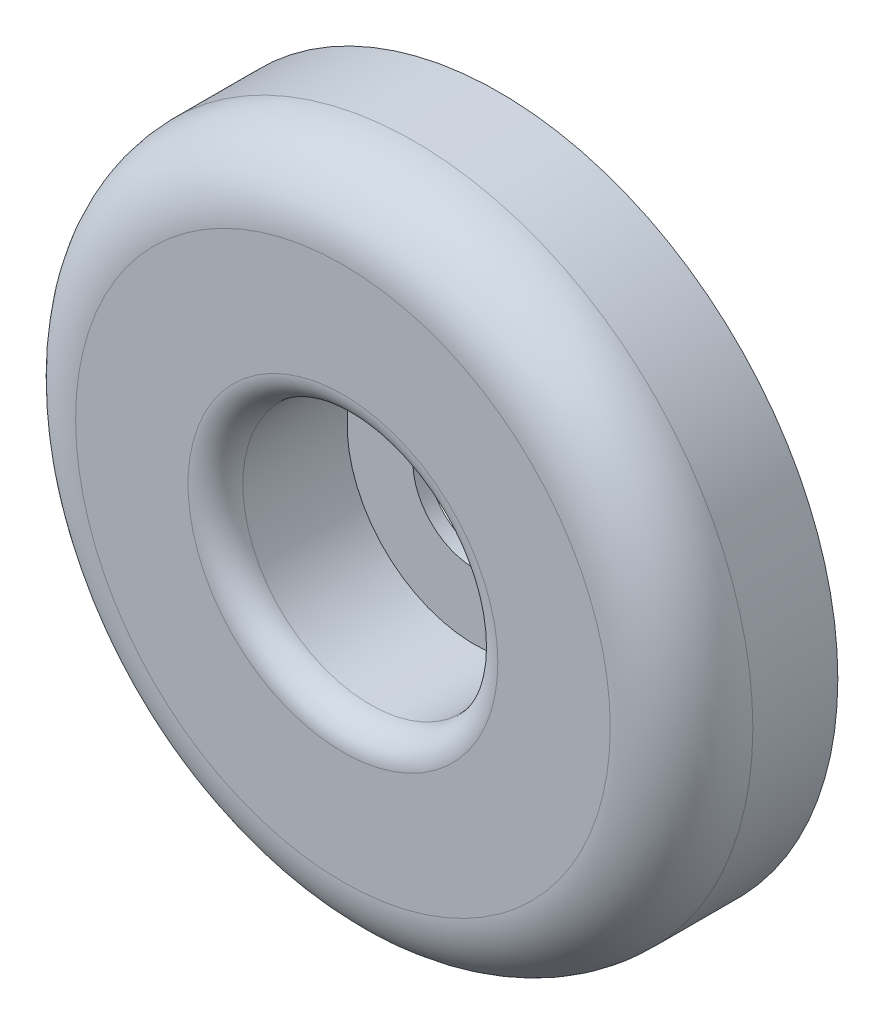
ISO-10303-21;
HEADER;
FILE_DESCRIPTION(('STEP AP214'),'2;1');
FILE_NAME('part.step','',(''),(''),'','','');
FILE_SCHEMA(('AUTOMOTIVE_DESIGN { 1 0 10303 214 1 1 1 1 }'));
ENDSEC;
DATA;
#1=APPLICATION_CONTEXT('core data for automotive mechanical design processes');
#2=APPLICATION_PROTOCOL_DEFINITION('international standard','automotive_design',2000,#1);
#3=PRODUCT_CONTEXT('',#1,'mechanical');
#4=PRODUCT('Part','Part','',(#3));
#5=PRODUCT_RELATED_PRODUCT_CATEGORY('part','',(#4));
#6=PRODUCT_DEFINITION_FORMATION('','',#4);
#7=PRODUCT_DEFINITION_CONTEXT('part definition',#1,'design');
#8=PRODUCT_DEFINITION('design','',#6,#7);
#9=PRODUCT_DEFINITION_SHAPE('','',#8);
#10=(LENGTH_UNIT() NAMED_UNIT(*) SI_UNIT(.MILLI.,.METRE.));
#11=(NAMED_UNIT(*) PLANE_ANGLE_UNIT() SI_UNIT($,.RADIAN.));
#12=(NAMED_UNIT(*) SI_UNIT($,.STERADIAN.) SOLID_ANGLE_UNIT());
#13=UNCERTAINTY_MEASURE_WITH_UNIT(LENGTH_MEASURE(1.E-05),#10,'distance_accuracy_value','');
#14=(GEOMETRIC_REPRESENTATION_CONTEXT(3) GLOBAL_UNCERTAINTY_ASSIGNED_CONTEXT((#13)) GLOBAL_UNIT_ASSIGNED_CONTEXT((#10,
#11,#12)) REPRESENTATION_CONTEXT('',''));
#15=CARTESIAN_POINT('',(0.,0.,0.));
#16=DIRECTION('',(0.,0.,1.));
#17=DIRECTION('',(1.,0.,0.));
#18=AXIS2_PLACEMENT_3D('',#15,#16,#17);
#19=CARTESIAN_POINT('',(0.,2.25,0.));
#20=DIRECTION('',(0.,0.,-1.));
#21=DIRECTION('',(-1.,0.,0.));
#22=AXIS2_PLACEMENT_3D('',#19,#20,#21);
#23=PLANE('',#22);
#24=CARTESIAN_POINT('',(0.,0.,0.));
#25=DIRECTION('',(0.,0.,1.));
#26=DIRECTION('',(1.,0.,0.));
#27=AXIS2_PLACEMENT_3D('',#24,#25,#26);
#28=CIRCLE('',#27,2.25);
#29=CARTESIAN_POINT('',(2.25,0.,0.));
#30=VERTEX_POINT('',#29);
#31=EDGE_CURVE('E10',#30,#30,#28,.T.);
#32=ORIENTED_EDGE('',*,*,#31,.F.);
#33=EDGE_LOOP('',(#32));
#34=FACE_BOUND('',#33,.T.);
#35=CARTESIAN_POINT('',(0.,0.,0.));
#36=DIRECTION('',(0.,0.,1.));
#37=DIRECTION('',(1.,0.,0.));
#38=AXIS2_PLACEMENT_3D('',#35,#36,#37);
#39=CIRCLE('',#38,4.65);
#40=CARTESIAN_POINT('',(4.65,0.,0.));
#41=VERTEX_POINT('',#40);
#42=EDGE_CURVE('E68',#41,#41,#39,.T.);
#43=ORIENTED_EDGE('',*,*,#42,.T.);
#44=EDGE_LOOP('',(#43));
#45=FACE_BOUND('',#44,.T.);
#46=ADVANCED_FACE('F34',(#34,#45),#23,.F.);
#47=CARTESIAN_POINT('',(0.,0.,13.0520481927711));
#48=DIRECTION('',(0.,0.,1.));
#49=DIRECTION('',(1.,0.,0.));
#50=AXIS2_PLACEMENT_3D('',#47,#48,#49);
#51=CYLINDRICAL_SURFACE('',#50,2.25);
#52=CARTESIAN_POINT('',(0.,0.,-0.5));
#53=DIRECTION('',(0.,0.,1.));
#54=DIRECTION('',(1.,0.,0.));
#55=AXIS2_PLACEMENT_3D('',#52,#53,#54);
#56=CIRCLE('',#55,2.25);
#57=CARTESIAN_POINT('',(2.25,0.,-0.5));
#58=VERTEX_POINT('',#57);
#59=EDGE_CURVE('E40',#58,#58,#56,.T.);
#60=ORIENTED_EDGE('',*,*,#59,.F.);
#61=EDGE_LOOP('',(#60));
#62=FACE_BOUND('',#61,.T.);
#63=ORIENTED_EDGE('',*,*,#31,.T.);
#64=EDGE_LOOP('',(#63));
#65=FACE_BOUND('',#64,.T.);
#66=ADVANCED_FACE('F117',(#62,#65),#51,.F.);
#67=CARTESIAN_POINT('',(0.,2.25,-0.5));
#68=DIRECTION('',(0.,0.,1.));
#69=DIRECTION('',(1.,0.,0.));
#70=AXIS2_PLACEMENT_3D('',#67,#68,#69);
#71=PLANE('',#70);
#72=CARTESIAN_POINT('',(0.,0.,-0.5));
#73=DIRECTION('',(0.,0.,1.));
#74=DIRECTION('',(1.,0.,0.));
#75=AXIS2_PLACEMENT_3D('',#72,#73,#74);
#76=CIRCLE('',#75,4.65);
#77=CARTESIAN_POINT('',(4.65,0.,-0.5));
#78=VERTEX_POINT('',#77);
#79=EDGE_CURVE('E44',#78,#78,#76,.T.);
#80=ORIENTED_EDGE('',*,*,#79,.F.);
#81=EDGE_LOOP('',(#80));
#82=FACE_BOUND('',#81,.T.);
#83=ORIENTED_EDGE('',*,*,#59,.T.);
#84=EDGE_LOOP('',(#83));
#85=FACE_BOUND('',#84,.T.);
#86=ADVANCED_FACE('F112',(#82,#85),#71,.F.);
#87=CARTESIAN_POINT('',(0.,0.,13.0520481927711));
#88=DIRECTION('',(0.,0.,1.));
#89=DIRECTION('',(1.,0.,0.));
#90=AXIS2_PLACEMENT_3D('',#87,#88,#89);
#91=CYLINDRICAL_SURFACE('',#90,4.65);
#92=CARTESIAN_POINT('',(0.,0.,-0.9));
#93=DIRECTION('',(0.,0.,1.));
#94=DIRECTION('',(1.,0.,0.));
#95=AXIS2_PLACEMENT_3D('',#92,#93,#94);
#96=CIRCLE('',#95,4.65);
#97=CARTESIAN_POINT('',(4.65,0.,-0.9));
#98=VERTEX_POINT('',#97);
#99=EDGE_CURVE('E48',#98,#98,#96,.T.);
#100=ORIENTED_EDGE('',*,*,#99,.F.);
#101=EDGE_LOOP('',(#100));
#102=FACE_BOUND('',#101,.T.);
#103=ORIENTED_EDGE('',*,*,#79,.T.);
#104=EDGE_LOOP('',(#103));
#105=FACE_BOUND('',#104,.T.);
#106=ADVANCED_FACE('F106',(#102,#105),#91,.F.);
#107=CARTESIAN_POINT('',(0.,12.35,-0.9));
#108=DIRECTION('',(0.,0.,1.));
#109=DIRECTION('',(1.,0.,0.));
#110=AXIS2_PLACEMENT_3D('',#107,#108,#109);
#111=PLANE('',#110);
#112=CARTESIAN_POINT('',(0.,0.,-0.9));
#113=DIRECTION('',(0.,0.,1.));
#114=DIRECTION('',(1.,0.,0.));
#115=AXIS2_PLACEMENT_3D('',#112,#113,#114);
#116=CIRCLE('',#115,12.35);
#117=CARTESIAN_POINT('',(12.35,0.,-0.9));
#118=VERTEX_POINT('',#117);
#119=EDGE_CURVE('E53',#118,#118,#116,.T.);
#120=ORIENTED_EDGE('',*,*,#119,.F.);
#121=EDGE_LOOP('',(#120));
#122=FACE_BOUND('',#121,.T.);
#123=ORIENTED_EDGE('',*,*,#99,.T.);
#124=EDGE_LOOP('',(#123));
#125=FACE_BOUND('',#124,.T.);
#126=ADVANCED_FACE('F100',(#122,#125),#111,.F.);
#127=CARTESIAN_POINT('',(0.,0.,13.0520481927711));
#128=DIRECTION('',(0.,0.,1.));
#129=DIRECTION('',(1.,0.,0.));
#130=AXIS2_PLACEMENT_3D('',#127,#128,#129);
#131=CYLINDRICAL_SURFACE('',#130,12.35);
#132=CARTESIAN_POINT('',(0.,0.,2.2));
#133=DIRECTION('',(0.,0.,1.));
#134=DIRECTION('',(1.,0.,0.));
#135=AXIS2_PLACEMENT_3D('',#132,#133,#134);
#136=CIRCLE('',#135,12.35);
#137=CARTESIAN_POINT('',(12.35,0.,2.2));
#138=VERTEX_POINT('',#137);
#139=EDGE_CURVE('E56',#138,#138,#136,.T.);
#140=ORIENTED_EDGE('',*,*,#139,.F.);
#141=EDGE_LOOP('',(#140));
#142=FACE_BOUND('',#141,.T.);
#143=ORIENTED_EDGE('',*,*,#119,.T.);
#144=EDGE_LOOP('',(#143));
#145=FACE_BOUND('',#144,.T.);
#146=ADVANCED_FACE('F94',(#142,#145),#131,.T.);
#147=CARTESIAN_POINT('',(0.,0.,2.2));
#148=DIRECTION('',(0.,0.,1.));
#149=DIRECTION('',(1.,0.,0.));
#150=AXIS2_PLACEMENT_3D('',#147,#148,#149);
#151=TOROIDAL_SURFACE('',#150,9.75,2.6);
#152=CARTESIAN_POINT('',(0.,0.,4.8));
#153=DIRECTION('',(0.,0.,1.));
#154=DIRECTION('',(1.,0.,0.));
#155=AXIS2_PLACEMENT_3D('',#152,#153,#154);
#156=CIRCLE('',#155,9.75);
#157=CARTESIAN_POINT('',(9.75,0.,4.8));
#158=VERTEX_POINT('',#157);
#159=EDGE_CURVE('E59',#158,#158,#156,.T.);
#160=ORIENTED_EDGE('',*,*,#159,.F.);
#161=EDGE_LOOP('',(#160));
#162=FACE_BOUND('',#161,.T.);
#163=ORIENTED_EDGE('',*,*,#139,.T.);
#164=EDGE_LOOP('',(#163));
#165=FACE_BOUND('',#164,.T.);
#166=ADVANCED_FACE('F88',(#162,#165),#151,.T.);
#167=CARTESIAN_POINT('',(0.,9.75,4.8));
#168=DIRECTION('',(0.,0.,-1.));
#169=DIRECTION('',(-1.,0.,0.));
#170=AXIS2_PLACEMENT_3D('',#167,#168,#169);
#171=PLANE('',#170);
#172=CARTESIAN_POINT('',(0.,0.,4.8));
#173=DIRECTION('',(0.,0.,1.));
#174=DIRECTION('',(1.,0.,0.));
#175=AXIS2_PLACEMENT_3D('',#172,#173,#174);
#176=CIRCLE('',#175,5.65);
#177=CARTESIAN_POINT('',(5.65,0.,4.8));
#178=VERTEX_POINT('',#177);
#179=EDGE_CURVE('E62',#178,#178,#176,.T.);
#180=ORIENTED_EDGE('',*,*,#179,.F.);
#181=EDGE_LOOP('',(#180));
#182=FACE_BOUND('',#181,.T.);
#183=ORIENTED_EDGE('',*,*,#159,.T.);
#184=EDGE_LOOP('',(#183));
#185=FACE_BOUND('',#184,.T.);
#186=ADVANCED_FACE('F82',(#182,#185),#171,.F.);
#187=CARTESIAN_POINT('',(0.,0.,3.8));
#188=DIRECTION('',(0.,0.,1.));
#189=DIRECTION('',(1.,0.,0.));
#190=AXIS2_PLACEMENT_3D('',#187,#188,#189);
#191=TOROIDAL_SURFACE('',#190,5.65,1.);
#192=CARTESIAN_POINT('',(0.,0.,3.8));
#193=DIRECTION('',(0.,0.,1.));
#194=DIRECTION('',(1.,0.,0.));
#195=AXIS2_PLACEMENT_3D('',#192,#193,#194);
#196=CIRCLE('',#195,4.65);
#197=CARTESIAN_POINT('',(4.65,0.,3.8));
#198=VERTEX_POINT('',#197);
#199=EDGE_CURVE('E65',#198,#198,#196,.T.);
#200=ORIENTED_EDGE('',*,*,#199,.F.);
#201=EDGE_LOOP('',(#200));
#202=FACE_BOUND('',#201,.T.);
#203=ORIENTED_EDGE('',*,*,#179,.T.);
#204=EDGE_LOOP('',(#203));
#205=FACE_BOUND('',#204,.T.);
#206=ADVANCED_FACE('F76',(#202,#205),#191,.T.);
#207=CARTESIAN_POINT('',(0.,0.,13.0520481927711));
#208=DIRECTION('',(0.,0.,1.));
#209=DIRECTION('',(1.,0.,0.));
#210=AXIS2_PLACEMENT_3D('',#207,#208,#209);
#211=CYLINDRICAL_SURFACE('',#210,4.65);
#212=ORIENTED_EDGE('',*,*,#42,.F.);
#213=EDGE_LOOP('',(#212));
#214=FACE_BOUND('',#213,.T.);
#215=ORIENTED_EDGE('',*,*,#199,.T.);
#216=EDGE_LOOP('',(#215));
#217=FACE_BOUND('',#216,.T.);
#218=ADVANCED_FACE('F73',(#214,#217),#211,.F.);
#219=CLOSED_SHELL('',(#46,#66,#86,#106,#126,#146,#166,#186,#206,#218));
#220=MANIFOLD_SOLID_BREP('B2',#219);
#221=ADVANCED_BREP_SHAPE_REPRESENTATION('',(#18,#220),#14);
#222=SHAPE_DEFINITION_REPRESENTATION(#9,#221);
ENDSEC;
END-ISO-10303-21;
